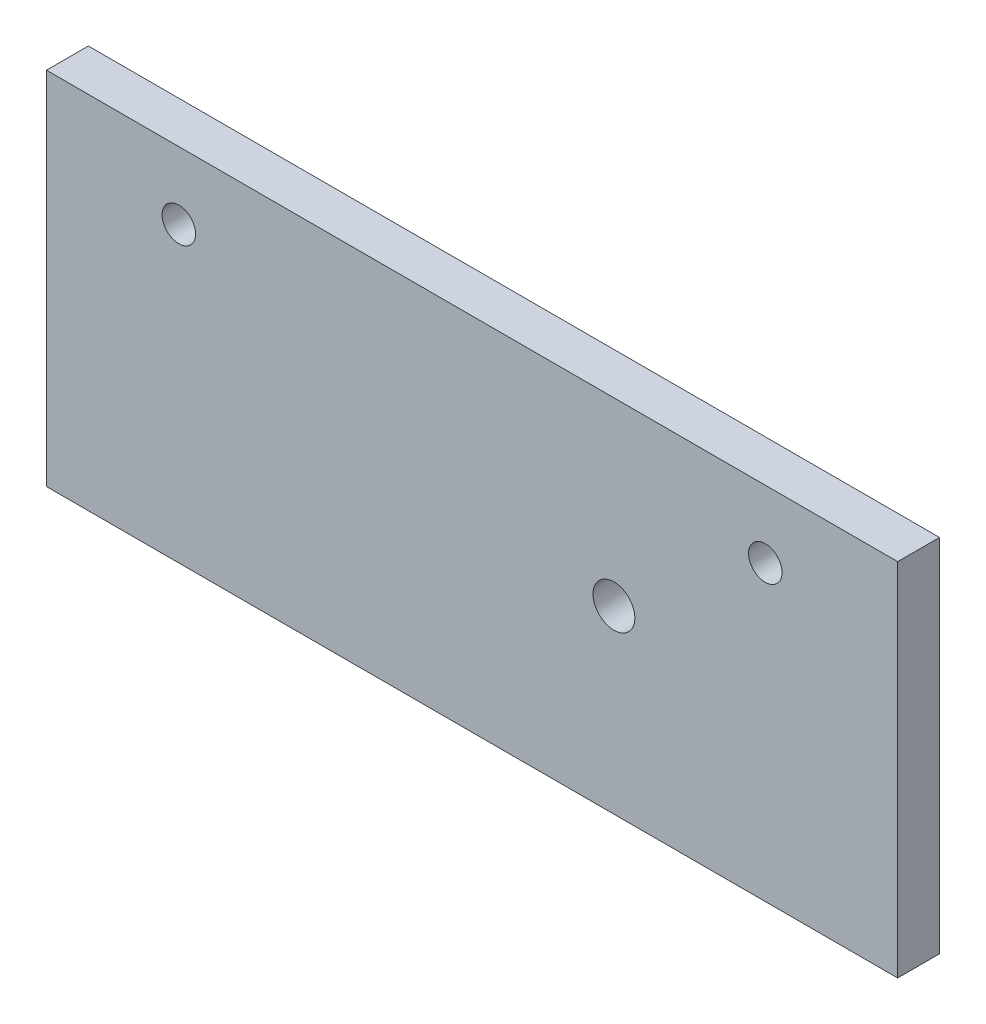
ISO-10303-21;
HEADER;
FILE_DESCRIPTION(('STEP AP214'),'2;1');
FILE_NAME('part.step','',(''),(''),'','','');
FILE_SCHEMA(('AUTOMOTIVE_DESIGN { 1 0 10303 214 1 1 1 1 }'));
ENDSEC;
DATA;
#1=APPLICATION_CONTEXT('core data for automotive mechanical design processes');
#2=APPLICATION_PROTOCOL_DEFINITION('international standard','automotive_design',2000,#1);
#3=PRODUCT_CONTEXT('',#1,'mechanical');
#4=PRODUCT('Part','Part','',(#3));
#5=PRODUCT_RELATED_PRODUCT_CATEGORY('part','',(#4));
#6=PRODUCT_DEFINITION_FORMATION('','',#4);
#7=PRODUCT_DEFINITION_CONTEXT('part definition',#1,'design');
#8=PRODUCT_DEFINITION('design','',#6,#7);
#9=PRODUCT_DEFINITION_SHAPE('','',#8);
#10=(LENGTH_UNIT() NAMED_UNIT(*) SI_UNIT(.MILLI.,.METRE.));
#11=(NAMED_UNIT(*) PLANE_ANGLE_UNIT() SI_UNIT($,.RADIAN.));
#12=(NAMED_UNIT(*) SI_UNIT($,.STERADIAN.) SOLID_ANGLE_UNIT());
#13=UNCERTAINTY_MEASURE_WITH_UNIT(LENGTH_MEASURE(1.E-05),#10,'distance_accuracy_value','');
#14=(GEOMETRIC_REPRESENTATION_CONTEXT(3) GLOBAL_UNCERTAINTY_ASSIGNED_CONTEXT((#13)) GLOBAL_UNIT_ASSIGNED_CONTEXT((#10,
#11,#12)) REPRESENTATION_CONTEXT('',''));
#15=CARTESIAN_POINT('',(0.,0.,0.));
#16=DIRECTION('',(0.,0.,1.));
#17=DIRECTION('',(1.,0.,0.));
#18=AXIS2_PLACEMENT_3D('',#15,#16,#17);
#19=CARTESIAN_POINT('',(50.8,21.52,5.));
#20=DIRECTION('',(-1.,0.,0.));
#21=DIRECTION('',(0.,0.,1.));
#22=AXIS2_PLACEMENT_3D('',#19,#20,#21);
#23=PLANE('',#22);
#24=DIRECTION('',(0.,1.,0.));
#25=VECTOR('',#24,1.);
#26=CARTESIAN_POINT('',(50.8,21.52,0.));
#27=LINE('',#26,#25);
#28=CARTESIAN_POINT('',(50.8,-21.52,0.));
#29=VERTEX_POINT('',#28);
#30=CARTESIAN_POINT('',(50.8,21.52,0.));
#31=VERTEX_POINT('',#30);
#32=EDGE_CURVE('E113',#29,#31,#27,.T.);
#33=ORIENTED_EDGE('',*,*,#32,.T.);
#34=DIRECTION('',(0.,0.,-1.));
#35=VECTOR('',#34,1.);
#36=CARTESIAN_POINT('',(50.8,21.52,5.));
#37=LINE('',#36,#35);
#38=CARTESIAN_POINT('',(50.8,21.52,5.));
#39=VERTEX_POINT('',#38);
#40=EDGE_CURVE('E11',#39,#31,#37,.T.);
#41=ORIENTED_EDGE('',*,*,#40,.F.);
#42=DIRECTION('',(0.,1.,0.));
#43=VECTOR('',#42,1.);
#44=CARTESIAN_POINT('',(50.8,21.52,5.));
#45=LINE('',#44,#43);
#46=CARTESIAN_POINT('',(50.8,-21.52,5.));
#47=VERTEX_POINT('',#46);
#48=EDGE_CURVE('E97',#47,#39,#45,.T.);
#49=ORIENTED_EDGE('',*,*,#48,.F.);
#50=DIRECTION('',(0.,0.,-1.));
#51=VECTOR('',#50,1.);
#52=CARTESIAN_POINT('',(50.8,-21.52,5.));
#53=LINE('',#52,#51);
#54=EDGE_CURVE('E109',#47,#29,#53,.T.);
#55=ORIENTED_EDGE('',*,*,#54,.T.);
#56=EDGE_LOOP('',(#33,#41,#49,#55));
#57=FACE_BOUND('',#56,.T.);
#58=ADVANCED_FACE('F45',(#57),#23,.F.);
#59=CARTESIAN_POINT('',(-50.8,21.52,5.));
#60=DIRECTION('',(0.,-1.,0.));
#61=DIRECTION('',(0.,0.,-1.));
#62=AXIS2_PLACEMENT_3D('',#59,#60,#61);
#63=PLANE('',#62);
#64=DIRECTION('',(-1.,0.,0.));
#65=VECTOR('',#64,1.);
#66=CARTESIAN_POINT('',(-50.8,21.52,0.));
#67=LINE('',#66,#65);
#68=CARTESIAN_POINT('',(-50.8,21.52,0.));
#69=VERTEX_POINT('',#68);
#70=EDGE_CURVE('E102',#31,#69,#67,.T.);
#71=ORIENTED_EDGE('',*,*,#70,.T.);
#72=DIRECTION('',(0.,0.,-1.));
#73=VECTOR('',#72,1.);
#74=CARTESIAN_POINT('',(-50.8,21.52,5.));
#75=LINE('',#74,#73);
#76=CARTESIAN_POINT('',(-50.8,21.52,5.));
#77=VERTEX_POINT('',#76);
#78=EDGE_CURVE('E54',#77,#69,#75,.T.);
#79=ORIENTED_EDGE('',*,*,#78,.F.);
#80=DIRECTION('',(-1.,0.,0.));
#81=VECTOR('',#80,1.);
#82=CARTESIAN_POINT('',(-50.8,21.52,5.));
#83=LINE('',#82,#81);
#84=EDGE_CURVE('E92',#39,#77,#83,.T.);
#85=ORIENTED_EDGE('',*,*,#84,.F.);
#86=ORIENTED_EDGE('',*,*,#40,.T.);
#87=EDGE_LOOP('',(#71,#79,#85,#86));
#88=FACE_BOUND('',#87,.T.);
#89=ADVANCED_FACE('F101',(#88),#63,.F.);
#90=CARTESIAN_POINT('',(-50.8,21.52,5.));
#91=DIRECTION('',(1.,0.,0.));
#92=DIRECTION('',(0.,1.,0.));
#93=AXIS2_PLACEMENT_3D('',#90,#91,#92);
#94=PLANE('',#93);
#95=DIRECTION('',(0.,-1.,0.));
#96=VECTOR('',#95,1.);
#97=CARTESIAN_POINT('',(-50.8,21.52,0.));
#98=LINE('',#97,#96);
#99=CARTESIAN_POINT('',(-50.8,-21.52,0.));
#100=VERTEX_POINT('',#99);
#101=EDGE_CURVE('E79',#69,#100,#98,.T.);
#102=ORIENTED_EDGE('',*,*,#101,.T.);
#103=DIRECTION('',(0.,0.,-1.));
#104=VECTOR('',#103,1.);
#105=CARTESIAN_POINT('',(-50.8,-21.52,5.));
#106=LINE('',#105,#104);
#107=CARTESIAN_POINT('',(-50.8,-21.52,5.));
#108=VERTEX_POINT('',#107);
#109=EDGE_CURVE('E104',#108,#100,#106,.T.);
#110=ORIENTED_EDGE('',*,*,#109,.F.);
#111=DIRECTION('',(0.,-1.,0.));
#112=VECTOR('',#111,1.);
#113=CARTESIAN_POINT('',(-50.8,21.52,5.));
#114=LINE('',#113,#112);
#115=EDGE_CURVE('E95',#77,#108,#114,.T.);
#116=ORIENTED_EDGE('',*,*,#115,.F.);
#117=ORIENTED_EDGE('',*,*,#78,.T.);
#118=EDGE_LOOP('',(#102,#110,#116,#117));
#119=FACE_BOUND('',#118,.T.);
#120=ADVANCED_FACE('F105',(#119),#94,.F.);
#121=CARTESIAN_POINT('',(-50.8,-21.52,5.));
#122=DIRECTION('',(0.,1.,0.));
#123=DIRECTION('',(0.,0.,1.));
#124=AXIS2_PLACEMENT_3D('',#121,#122,#123);
#125=PLANE('',#124);
#126=DIRECTION('',(1.,0.,0.));
#127=VECTOR('',#126,1.);
#128=CARTESIAN_POINT('',(-50.8,-21.52,0.));
#129=LINE('',#128,#127);
#130=EDGE_CURVE('E85',#100,#29,#129,.T.);
#131=ORIENTED_EDGE('',*,*,#130,.T.);
#132=ORIENTED_EDGE('',*,*,#54,.F.);
#133=DIRECTION('',(1.,0.,0.));
#134=VECTOR('',#133,1.);
#135=CARTESIAN_POINT('',(-50.8,-21.52,5.));
#136=LINE('',#135,#134);
#137=EDGE_CURVE('E62',#108,#47,#136,.T.);
#138=ORIENTED_EDGE('',*,*,#137,.F.);
#139=ORIENTED_EDGE('',*,*,#109,.T.);
#140=EDGE_LOOP('',(#131,#132,#138,#139));
#141=FACE_BOUND('',#140,.T.);
#142=ADVANCED_FACE('F127',(#141),#125,.F.);
#143=CARTESIAN_POINT('',(0.,0.,5.));
#144=DIRECTION('',(0.,0.,1.));
#145=DIRECTION('',(1.,0.,0.));
#146=AXIS2_PLACEMENT_3D('',#143,#144,#145);
#147=PLANE('',#146);
#148=CARTESIAN_POINT('',(-35.,13.48,5.));
#149=DIRECTION('',(0.,0.,1.));
#150=DIRECTION('',(1.,0.,0.));
#151=AXIS2_PLACEMENT_3D('',#148,#149,#150);
#152=CIRCLE('',#151,2.);
#153=CARTESIAN_POINT('',(-33.,13.48,5.));
#154=VERTEX_POINT('',#153);
#155=EDGE_CURVE('E150',#154,#154,#152,.T.);
#156=ORIENTED_EDGE('',*,*,#155,.F.);
#157=EDGE_LOOP('',(#156));
#158=FACE_BOUND('',#157,.T.);
#159=CARTESIAN_POINT('',(35.,13.48,5.));
#160=DIRECTION('',(0.,0.,1.));
#161=DIRECTION('',(1.,0.,0.));
#162=AXIS2_PLACEMENT_3D('',#159,#160,#161);
#163=CIRCLE('',#162,2.);
#164=CARTESIAN_POINT('',(37.,13.48,5.));
#165=VERTEX_POINT('',#164);
#166=EDGE_CURVE('E146',#165,#165,#163,.T.);
#167=ORIENTED_EDGE('',*,*,#166,.F.);
#168=EDGE_LOOP('',(#167));
#169=FACE_BOUND('',#168,.T.);
#170=CARTESIAN_POINT('',(16.93333334,0.,5.));
#171=DIRECTION('',(0.,0.,1.));
#172=DIRECTION('',(1.,0.,0.));
#173=AXIS2_PLACEMENT_3D('',#170,#171,#172);
#174=CIRCLE('',#173,2.5);
#175=CARTESIAN_POINT('',(19.43333334,0.,5.));
#176=VERTEX_POINT('',#175);
#177=EDGE_CURVE('E134',#176,#176,#174,.T.);
#178=ORIENTED_EDGE('',*,*,#177,.F.);
#179=EDGE_LOOP('',(#178));
#180=FACE_BOUND('',#179,.T.);
#181=ORIENTED_EDGE('',*,*,#48,.T.);
#182=ORIENTED_EDGE('',*,*,#84,.T.);
#183=ORIENTED_EDGE('',*,*,#115,.T.);
#184=ORIENTED_EDGE('',*,*,#137,.T.);
#185=EDGE_LOOP('',(#181,#182,#183,#184));
#186=FACE_BOUND('',#185,.T.);
#187=ADVANCED_FACE('F93',(#158,#169,#180,#186),#147,.T.);
#188=CARTESIAN_POINT('',(0.,0.,0.));
#189=DIRECTION('',(0.,0.,1.));
#190=DIRECTION('',(1.,0.,0.));
#191=AXIS2_PLACEMENT_3D('',#188,#189,#190);
#192=PLANE('',#191);
#193=CARTESIAN_POINT('',(-35.,13.48,0.));
#194=DIRECTION('',(0.,0.,1.));
#195=DIRECTION('',(1.,0.,0.));
#196=AXIS2_PLACEMENT_3D('',#193,#194,#195);
#197=CIRCLE('',#196,2.);
#198=CARTESIAN_POINT('',(-33.,13.48,0.));
#199=VERTEX_POINT('',#198);
#200=EDGE_CURVE('E138',#199,#199,#197,.T.);
#201=ORIENTED_EDGE('',*,*,#200,.T.);
#202=EDGE_LOOP('',(#201));
#203=FACE_BOUND('',#202,.T.);
#204=CARTESIAN_POINT('',(35.,13.48,0.));
#205=DIRECTION('',(0.,0.,1.));
#206=DIRECTION('',(1.,0.,0.));
#207=AXIS2_PLACEMENT_3D('',#204,#205,#206);
#208=CIRCLE('',#207,2.);
#209=CARTESIAN_POINT('',(37.,13.48,0.));
#210=VERTEX_POINT('',#209);
#211=EDGE_CURVE('E142',#210,#210,#208,.T.);
#212=ORIENTED_EDGE('',*,*,#211,.T.);
#213=EDGE_LOOP('',(#212));
#214=FACE_BOUND('',#213,.T.);
#215=CARTESIAN_POINT('',(16.93333334,0.,0.));
#216=DIRECTION('',(0.,0.,1.));
#217=DIRECTION('',(1.,0.,0.));
#218=AXIS2_PLACEMENT_3D('',#215,#216,#217);
#219=CIRCLE('',#218,2.5);
#220=CARTESIAN_POINT('',(19.43333334,0.,0.));
#221=VERTEX_POINT('',#220);
#222=EDGE_CURVE('E117',#221,#221,#219,.T.);
#223=ORIENTED_EDGE('',*,*,#222,.T.);
#224=EDGE_LOOP('',(#223));
#225=FACE_BOUND('',#224,.T.);
#226=ORIENTED_EDGE('',*,*,#32,.F.);
#227=ORIENTED_EDGE('',*,*,#130,.F.);
#228=ORIENTED_EDGE('',*,*,#101,.F.);
#229=ORIENTED_EDGE('',*,*,#70,.F.);
#230=EDGE_LOOP('',(#226,#227,#228,#229));
#231=FACE_BOUND('',#230,.T.);
#232=ADVANCED_FACE('F130',(#203,#214,#225,#231),#192,.F.);
#233=CARTESIAN_POINT('',(16.93333334,0.,0.));
#234=DIRECTION('',(0.,0.,1.));
#235=DIRECTION('',(1.,0.,0.));
#236=AXIS2_PLACEMENT_3D('',#233,#234,#235);
#237=CYLINDRICAL_SURFACE('',#236,2.5);
#238=ORIENTED_EDGE('',*,*,#222,.F.);
#239=EDGE_LOOP('',(#238));
#240=FACE_BOUND('',#239,.T.);
#241=ORIENTED_EDGE('',*,*,#177,.T.);
#242=EDGE_LOOP('',(#241));
#243=FACE_BOUND('',#242,.T.);
#244=ADVANCED_FACE('F174',(#240,#243),#237,.F.);
#245=CARTESIAN_POINT('',(35.,13.48,0.));
#246=DIRECTION('',(0.,0.,1.));
#247=DIRECTION('',(1.,0.,0.));
#248=AXIS2_PLACEMENT_3D('',#245,#246,#247);
#249=CYLINDRICAL_SURFACE('',#248,2.);
#250=ORIENTED_EDGE('',*,*,#211,.F.);
#251=EDGE_LOOP('',(#250));
#252=FACE_BOUND('',#251,.T.);
#253=ORIENTED_EDGE('',*,*,#166,.T.);
#254=EDGE_LOOP('',(#253));
#255=FACE_BOUND('',#254,.T.);
#256=ADVANCED_FACE('F163',(#252,#255),#249,.F.);
#257=CARTESIAN_POINT('',(-35.,13.48,0.));
#258=DIRECTION('',(0.,0.,1.));
#259=DIRECTION('',(1.,0.,0.));
#260=AXIS2_PLACEMENT_3D('',#257,#258,#259);
#261=CYLINDRICAL_SURFACE('',#260,2.);
#262=ORIENTED_EDGE('',*,*,#200,.F.);
#263=EDGE_LOOP('',(#262));
#264=FACE_BOUND('',#263,.T.);
#265=ORIENTED_EDGE('',*,*,#155,.T.);
#266=EDGE_LOOP('',(#265));
#267=FACE_BOUND('',#266,.T.);
#268=ADVANCED_FACE('F160',(#264,#267),#261,.F.);
#269=CLOSED_SHELL('',(#58,#89,#120,#142,#187,#232,#244,#256,#268));
#270=MANIFOLD_SOLID_BREP('B2',#269);
#271=ADVANCED_BREP_SHAPE_REPRESENTATION('',(#18,#270),#14);
#272=SHAPE_DEFINITION_REPRESENTATION(#9,#271);
ENDSEC;
END-ISO-10303-21;
